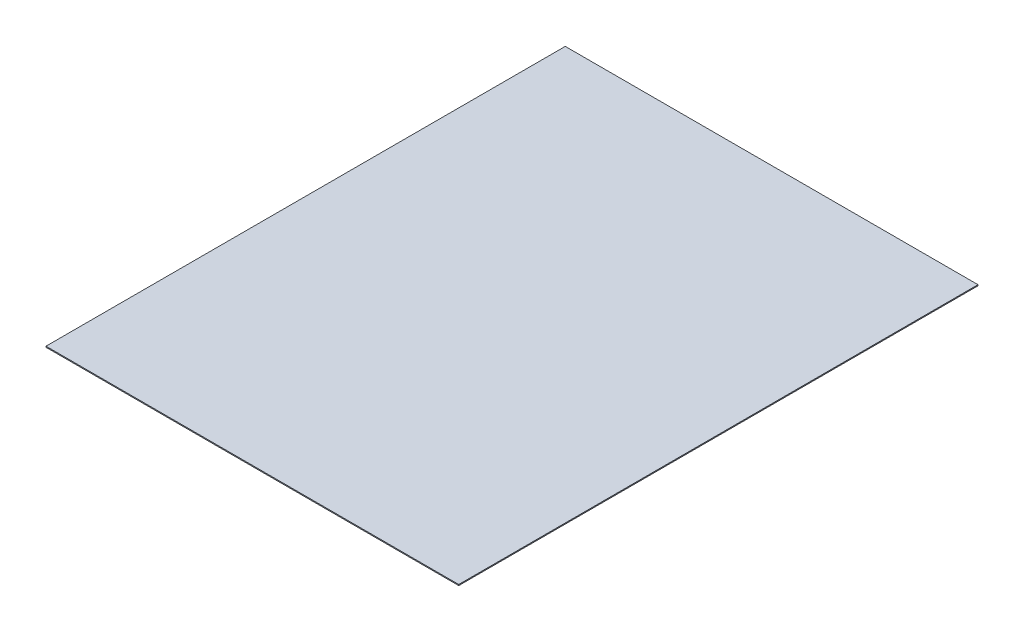
ISO-10303-21;
HEADER;
FILE_DESCRIPTION(('STEP AP214'),'2;1');
FILE_NAME('part.step','',(''),(''),'','','');
FILE_SCHEMA(('AUTOMOTIVE_DESIGN { 1 0 10303 214 1 1 1 1 }'));
ENDSEC;
DATA;
#1=APPLICATION_CONTEXT('core data for automotive mechanical design processes');
#2=APPLICATION_PROTOCOL_DEFINITION('international standard','automotive_design',2000,#1);
#3=PRODUCT_CONTEXT('',#1,'mechanical');
#4=PRODUCT('Part','Part','',(#3));
#5=PRODUCT_RELATED_PRODUCT_CATEGORY('part','',(#4));
#6=PRODUCT_DEFINITION_FORMATION('','',#4);
#7=PRODUCT_DEFINITION_CONTEXT('part definition',#1,'design');
#8=PRODUCT_DEFINITION('design','',#6,#7);
#9=PRODUCT_DEFINITION_SHAPE('','',#8);
#10=(LENGTH_UNIT() NAMED_UNIT(*) SI_UNIT(.MILLI.,.METRE.));
#11=(NAMED_UNIT(*) PLANE_ANGLE_UNIT() SI_UNIT($,.RADIAN.));
#12=(NAMED_UNIT(*) SI_UNIT($,.STERADIAN.) SOLID_ANGLE_UNIT());
#13=UNCERTAINTY_MEASURE_WITH_UNIT(LENGTH_MEASURE(1.E-05),#10,'distance_accuracy_value','');
#14=(GEOMETRIC_REPRESENTATION_CONTEXT(3) GLOBAL_UNCERTAINTY_ASSIGNED_CONTEXT((#13)) GLOBAL_UNIT_ASSIGNED_CONTEXT((#10,
#11,#12)) REPRESENTATION_CONTEXT('',''));
#15=CARTESIAN_POINT('',(0.,0.,0.));
#16=DIRECTION('',(0.,0.,1.));
#17=DIRECTION('',(1.,0.,0.));
#18=AXIS2_PLACEMENT_3D('',#15,#16,#17);
#19=CARTESIAN_POINT('',(40.,1152.,-800.));
#20=DIRECTION('',(-1.,0.,0.));
#21=DIRECTION('',(0.,0.,1.));
#22=AXIS2_PLACEMENT_3D('',#19,#20,#21);
#23=PLANE('',#22);
#24=DIRECTION('',(0.,-1.,0.));
#25=VECTOR('',#24,1.);
#26=CARTESIAN_POINT('',(40.,1152.,-20.));
#27=LINE('',#26,#25);
#28=CARTESIAN_POINT('',(40.,1153.5,-20.));
#29=VERTEX_POINT('',#28);
#30=CARTESIAN_POINT('',(40.,1152.,-20.));
#31=VERTEX_POINT('',#30);
#32=EDGE_CURVE('E103',#29,#31,#27,.T.);
#33=ORIENTED_EDGE('',*,*,#32,.F.);
#34=DIRECTION('',(0.,0.,1.));
#35=VECTOR('',#34,1.);
#36=CARTESIAN_POINT('',(40.,1153.5,-800.));
#37=LINE('',#36,#35);
#38=CARTESIAN_POINT('',(40.,1153.5,-800.));
#39=VERTEX_POINT('',#38);
#40=EDGE_CURVE('E11',#39,#29,#37,.T.);
#41=ORIENTED_EDGE('',*,*,#40,.F.);
#42=DIRECTION('',(0.,-1.,0.));
#43=VECTOR('',#42,1.);
#44=CARTESIAN_POINT('',(40.,1152.,-800.));
#45=LINE('',#44,#43);
#46=CARTESIAN_POINT('',(40.,1152.,-800.));
#47=VERTEX_POINT('',#46);
#48=EDGE_CURVE('E97',#39,#47,#45,.T.);
#49=ORIENTED_EDGE('',*,*,#48,.T.);
#50=DIRECTION('',(0.,0.,1.));
#51=VECTOR('',#50,1.);
#52=CARTESIAN_POINT('',(40.,1152.,-800.));
#53=LINE('',#52,#51);
#54=EDGE_CURVE('E42',#47,#31,#53,.T.);
#55=ORIENTED_EDGE('',*,*,#54,.T.);
#56=EDGE_LOOP('',(#33,#41,#49,#55));
#57=FACE_BOUND('',#56,.T.);
#58=ADVANCED_FACE('F39',(#57),#23,.T.);
#59=CARTESIAN_POINT('',(40.,1153.5,-800.));
#60=DIRECTION('',(0.,1.,0.));
#61=DIRECTION('',(0.,0.,1.));
#62=AXIS2_PLACEMENT_3D('',#59,#60,#61);
#63=PLANE('',#62);
#64=DIRECTION('',(-1.,0.,0.));
#65=VECTOR('',#64,1.);
#66=CARTESIAN_POINT('',(40.,1153.5,-20.));
#67=LINE('',#66,#65);
#68=CARTESIAN_POINT('',(660.,1153.5,-20.));
#69=VERTEX_POINT('',#68);
#70=EDGE_CURVE('E99',#69,#29,#67,.T.);
#71=ORIENTED_EDGE('',*,*,#70,.F.);
#72=DIRECTION('',(0.,0.,1.));
#73=VECTOR('',#72,1.);
#74=CARTESIAN_POINT('',(660.,1153.5,-800.));
#75=LINE('',#74,#73);
#76=CARTESIAN_POINT('',(660.,1153.5,-800.));
#77=VERTEX_POINT('',#76);
#78=EDGE_CURVE('E48',#77,#69,#75,.T.);
#79=ORIENTED_EDGE('',*,*,#78,.F.);
#80=DIRECTION('',(-1.,0.,0.));
#81=VECTOR('',#80,1.);
#82=CARTESIAN_POINT('',(40.,1153.5,-800.));
#83=LINE('',#82,#81);
#84=EDGE_CURVE('E94',#77,#39,#83,.T.);
#85=ORIENTED_EDGE('',*,*,#84,.T.);
#86=ORIENTED_EDGE('',*,*,#40,.T.);
#87=EDGE_LOOP('',(#71,#79,#85,#86));
#88=FACE_BOUND('',#87,.T.);
#89=ADVANCED_FACE('F113',(#88),#63,.T.);
#90=CARTESIAN_POINT('',(660.,1152.,-800.));
#91=DIRECTION('',(1.,0.,0.));
#92=DIRECTION('',(0.,0.,-1.));
#93=AXIS2_PLACEMENT_3D('',#90,#91,#92);
#94=PLANE('',#93);
#95=DIRECTION('',(0.,1.,0.));
#96=VECTOR('',#95,1.);
#97=CARTESIAN_POINT('',(660.,1152.,-20.));
#98=LINE('',#97,#96);
#99=CARTESIAN_POINT('',(660.,1152.,-20.));
#100=VERTEX_POINT('',#99);
#101=EDGE_CURVE('E89',#100,#69,#98,.T.);
#102=ORIENTED_EDGE('',*,*,#101,.F.);
#103=DIRECTION('',(0.,0.,1.));
#104=VECTOR('',#103,1.);
#105=CARTESIAN_POINT('',(660.,1152.,-800.));
#106=LINE('',#105,#104);
#107=CARTESIAN_POINT('',(660.,1152.,-800.));
#108=VERTEX_POINT('',#107);
#109=EDGE_CURVE('E84',#108,#100,#106,.T.);
#110=ORIENTED_EDGE('',*,*,#109,.F.);
#111=DIRECTION('',(0.,1.,0.));
#112=VECTOR('',#111,1.);
#113=CARTESIAN_POINT('',(660.,1152.,-800.));
#114=LINE('',#113,#112);
#115=EDGE_CURVE('E87',#108,#77,#114,.T.);
#116=ORIENTED_EDGE('',*,*,#115,.T.);
#117=ORIENTED_EDGE('',*,*,#78,.T.);
#118=EDGE_LOOP('',(#102,#110,#116,#117));
#119=FACE_BOUND('',#118,.T.);
#120=ADVANCED_FACE('F86',(#119),#94,.T.);
#121=CARTESIAN_POINT('',(40.,1152.,-800.));
#122=DIRECTION('',(0.,-1.,0.));
#123=DIRECTION('',(0.,0.,-1.));
#124=AXIS2_PLACEMENT_3D('',#121,#122,#123);
#125=PLANE('',#124);
#126=DIRECTION('',(1.,0.,0.));
#127=VECTOR('',#126,1.);
#128=CARTESIAN_POINT('',(40.,1152.,-20.));
#129=LINE('',#128,#127);
#130=EDGE_CURVE('E106',#31,#100,#129,.T.);
#131=ORIENTED_EDGE('',*,*,#130,.F.);
#132=ORIENTED_EDGE('',*,*,#54,.F.);
#133=DIRECTION('',(1.,0.,0.));
#134=VECTOR('',#133,1.);
#135=CARTESIAN_POINT('',(40.,1152.,-800.));
#136=LINE('',#135,#134);
#137=EDGE_CURVE('E93',#47,#108,#136,.T.);
#138=ORIENTED_EDGE('',*,*,#137,.T.);
#139=ORIENTED_EDGE('',*,*,#109,.T.);
#140=EDGE_LOOP('',(#131,#132,#138,#139));
#141=FACE_BOUND('',#140,.T.);
#142=ADVANCED_FACE('F96',(#141),#125,.T.);
#143=CARTESIAN_POINT('',(0.,0.,-800.));
#144=DIRECTION('',(0.,0.,-1.));
#145=DIRECTION('',(-1.,0.,0.));
#146=AXIS2_PLACEMENT_3D('',#143,#144,#145);
#147=PLANE('',#146);
#148=ORIENTED_EDGE('',*,*,#48,.F.);
#149=ORIENTED_EDGE('',*,*,#84,.F.);
#150=ORIENTED_EDGE('',*,*,#115,.F.);
#151=ORIENTED_EDGE('',*,*,#137,.F.);
#152=EDGE_LOOP('',(#148,#149,#150,#151));
#153=FACE_BOUND('',#152,.T.);
#154=ADVANCED_FACE('F92',(#153),#147,.T.);
#155=CARTESIAN_POINT('',(0.,0.,-20.));
#156=DIRECTION('',(0.,0.,-1.));
#157=DIRECTION('',(-1.,0.,0.));
#158=AXIS2_PLACEMENT_3D('',#155,#156,#157);
#159=PLANE('',#158);
#160=ORIENTED_EDGE('',*,*,#32,.T.);
#161=ORIENTED_EDGE('',*,*,#130,.T.);
#162=ORIENTED_EDGE('',*,*,#101,.T.);
#163=ORIENTED_EDGE('',*,*,#70,.T.);
#164=EDGE_LOOP('',(#160,#161,#162,#163));
#165=FACE_BOUND('',#164,.T.);
#166=ADVANCED_FACE('F112',(#165),#159,.F.);
#167=CLOSED_SHELL('',(#58,#89,#120,#142,#154,#166));
#168=MANIFOLD_SOLID_BREP('B2',#167);
#169=ADVANCED_BREP_SHAPE_REPRESENTATION('',(#18,#168),#14);
#170=SHAPE_DEFINITION_REPRESENTATION(#9,#169);
ENDSEC;
END-ISO-10303-21;
